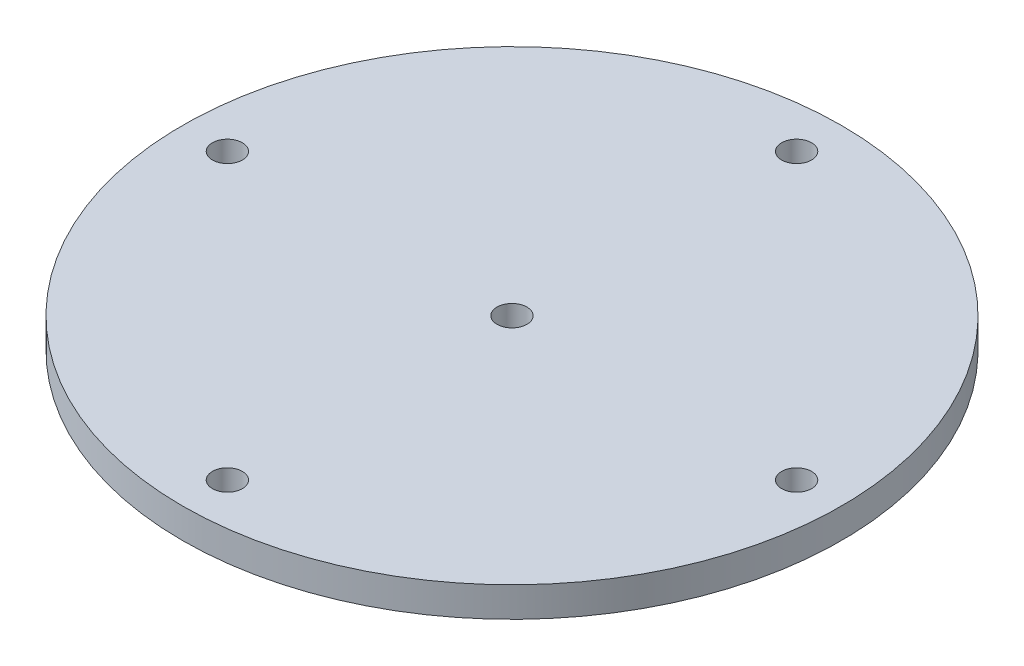
ISO-10303-21;
HEADER;
FILE_DESCRIPTION(('STEP AP214'),'2;1');
FILE_NAME('part.step','',(''),(''),'','','');
FILE_SCHEMA(('AUTOMOTIVE_DESIGN { 1 0 10303 214 1 1 1 1 }'));
ENDSEC;
DATA;
#1=APPLICATION_CONTEXT('core data for automotive mechanical design processes');
#2=APPLICATION_PROTOCOL_DEFINITION('international standard','automotive_design',2000,#1);
#3=PRODUCT_CONTEXT('',#1,'mechanical');
#4=PRODUCT('Part','Part','',(#3));
#5=PRODUCT_RELATED_PRODUCT_CATEGORY('part','',(#4));
#6=PRODUCT_DEFINITION_FORMATION('','',#4);
#7=PRODUCT_DEFINITION_CONTEXT('part definition',#1,'design');
#8=PRODUCT_DEFINITION('design','',#6,#7);
#9=PRODUCT_DEFINITION_SHAPE('','',#8);
#10=(LENGTH_UNIT() NAMED_UNIT(*) SI_UNIT(.MILLI.,.METRE.));
#11=(NAMED_UNIT(*) PLANE_ANGLE_UNIT() SI_UNIT($,.RADIAN.));
#12=(NAMED_UNIT(*) SI_UNIT($,.STERADIAN.) SOLID_ANGLE_UNIT());
#13=UNCERTAINTY_MEASURE_WITH_UNIT(LENGTH_MEASURE(1.E-05),#10,'distance_accuracy_value','');
#14=(GEOMETRIC_REPRESENTATION_CONTEXT(3) GLOBAL_UNCERTAINTY_ASSIGNED_CONTEXT((#13)) GLOBAL_UNIT_ASSIGNED_CONTEXT((#10,
#11,#12)) REPRESENTATION_CONTEXT('',''));
#15=CARTESIAN_POINT('',(0.,0.,0.));
#16=DIRECTION('',(0.,0.,1.));
#17=DIRECTION('',(1.,0.,0.));
#18=AXIS2_PLACEMENT_3D('',#15,#16,#17);
#19=CARTESIAN_POINT('',(0.,0.,0.));
#20=DIRECTION('',(0.,-1.,0.));
#21=DIRECTION('',(0.,0.,-1.));
#22=AXIS2_PLACEMENT_3D('',#19,#20,#21);
#23=PLANE('',#22);
#24=CARTESIAN_POINT('',(0.,0.,-190.));
#25=DIRECTION('',(0.,-1.,0.));
#26=DIRECTION('',(0.,0.,-1.));
#27=AXIS2_PLACEMENT_3D('',#24,#25,#26);
#28=CIRCLE('',#27,10.);
#29=CARTESIAN_POINT('',(0.,0.,-200.));
#30=VERTEX_POINT('',#29);
#31=EDGE_CURVE('E12',#30,#30,#28,.T.);
#32=ORIENTED_EDGE('',*,*,#31,.F.);
#33=EDGE_LOOP('',(#32));
#34=FACE_BOUND('',#33,.T.);
#35=ADVANCED_FACE('F52',(#34),#23,.F.);
#36=CARTESIAN_POINT('',(0.,0.,-190.));
#37=DIRECTION('',(0.,1.,0.));
#38=DIRECTION('',(0.,0.,1.));
#39=AXIS2_PLACEMENT_3D('',#36,#37,#38);
#40=CONICAL_SURFACE('',#39,10.,0.785398163397449);
#41=CARTESIAN_POINT('',(0.,-10.,-190.));
#42=VERTEX_POINT('',#41);
#43=VERTEX_LOOP('',#42);
#44=FACE_BOUND('',#43,.T.);
#45=ORIENTED_EDGE('',*,*,#31,.T.);
#46=EDGE_LOOP('',(#45));
#47=FACE_BOUND('',#46,.T.);
#48=ADVANCED_FACE('F59',(#44,#47),#40,.T.);
#49=CLOSED_SHELL('',(#35,#48));
#50=MANIFOLD_SOLID_BREP('B2',#49);
#51=CARTESIAN_POINT('',(0.,0.,0.));
#52=DIRECTION('',(0.,1.,0.));
#53=DIRECTION('',(0.,0.,1.));
#54=AXIS2_PLACEMENT_3D('',#51,#52,#53);
#55=PLANE('',#54);
#56=CARTESIAN_POINT('',(190.,0.,0.));
#57=DIRECTION('',(0.,1.,0.));
#58=DIRECTION('',(0.,0.,1.));
#59=AXIS2_PLACEMENT_3D('',#56,#57,#58);
#60=CIRCLE('',#59,10.);
#61=CARTESIAN_POINT('',(190.,0.,10.));
#62=VERTEX_POINT('',#61);
#63=EDGE_CURVE('E50',#62,#62,#60,.T.);
#64=ORIENTED_EDGE('',*,*,#63,.T.);
#65=EDGE_LOOP('',(#64));
#66=FACE_BOUND('',#65,.T.);
#67=ADVANCED_FACE('F90',(#66),#55,.T.);
#68=CARTESIAN_POINT('',(190.,0.,0.));
#69=DIRECTION('',(0.,1.,0.));
#70=DIRECTION('',(0.,0.,1.));
#71=AXIS2_PLACEMENT_3D('',#68,#69,#70);
#72=CONICAL_SURFACE('',#71,10.,0.785398163397449);
#73=CARTESIAN_POINT('',(190.,-9.99999999999996,0.));
#74=VERTEX_POINT('',#73);
#75=VERTEX_LOOP('',#74);
#76=FACE_BOUND('',#75,.T.);
#77=ORIENTED_EDGE('',*,*,#63,.F.);
#78=EDGE_LOOP('',(#77));
#79=FACE_BOUND('',#78,.T.);
#80=ADVANCED_FACE('F97',(#76,#79),#72,.T.);
#81=CLOSED_SHELL('',(#67,#80));
#82=MANIFOLD_SOLID_BREP('B6',#81);
#83=CARTESIAN_POINT('',(0.,0.,0.));
#84=DIRECTION('',(0.,-1.,0.));
#85=DIRECTION('',(0.,0.,-1.));
#86=AXIS2_PLACEMENT_3D('',#83,#84,#85);
#87=PLANE('',#86);
#88=CARTESIAN_POINT('',(0.,0.,190.));
#89=DIRECTION('',(0.,-1.,0.));
#90=DIRECTION('',(0.,0.,-1.));
#91=AXIS2_PLACEMENT_3D('',#88,#89,#90);
#92=CIRCLE('',#91,10.);
#93=CARTESIAN_POINT('',(0.,0.,180.));
#94=VERTEX_POINT('',#93);
#95=EDGE_CURVE('E88',#94,#94,#92,.T.);
#96=ORIENTED_EDGE('',*,*,#95,.F.);
#97=EDGE_LOOP('',(#96));
#98=FACE_BOUND('',#97,.T.);
#99=ADVANCED_FACE('F128',(#98),#87,.F.);
#100=CARTESIAN_POINT('',(0.,0.,190.));
#101=DIRECTION('',(0.,1.,0.));
#102=DIRECTION('',(0.,0.,1.));
#103=AXIS2_PLACEMENT_3D('',#100,#101,#102);
#104=CONICAL_SURFACE('',#103,10.,0.785398163397448);
#105=CARTESIAN_POINT('',(0.,-9.99999999999999,190.));
#106=VERTEX_POINT('',#105);
#107=VERTEX_LOOP('',#106);
#108=FACE_BOUND('',#107,.T.);
#109=ORIENTED_EDGE('',*,*,#95,.T.);
#110=EDGE_LOOP('',(#109));
#111=FACE_BOUND('',#110,.T.);
#112=ADVANCED_FACE('F135',(#108,#111),#104,.T.);
#113=CLOSED_SHELL('',(#99,#112));
#114=MANIFOLD_SOLID_BREP('B44',#113);
#115=CARTESIAN_POINT('',(0.,0.,0.));
#116=DIRECTION('',(0.,1.,0.));
#117=DIRECTION('',(0.,0.,1.));
#118=AXIS2_PLACEMENT_3D('',#115,#116,#117);
#119=PLANE('',#118);
#120=CARTESIAN_POINT('',(-190.,0.,0.));
#121=DIRECTION('',(0.,1.,0.));
#122=DIRECTION('',(0.,0.,1.));
#123=AXIS2_PLACEMENT_3D('',#120,#121,#122);
#124=CIRCLE('',#123,10.);
#125=CARTESIAN_POINT('',(-190.,0.,10.));
#126=VERTEX_POINT('',#125);
#127=EDGE_CURVE('E126',#126,#126,#124,.T.);
#128=ORIENTED_EDGE('',*,*,#127,.T.);
#129=EDGE_LOOP('',(#128));
#130=FACE_BOUND('',#129,.T.);
#131=ADVANCED_FACE('F166',(#130),#119,.T.);
#132=CARTESIAN_POINT('',(-190.,0.,0.));
#133=DIRECTION('',(0.,1.,0.));
#134=DIRECTION('',(0.,0.,1.));
#135=AXIS2_PLACEMENT_3D('',#132,#133,#134);
#136=CONICAL_SURFACE('',#135,10.,0.785398163397448);
#137=CARTESIAN_POINT('',(-190.,-9.99999999999999,0.));
#138=VERTEX_POINT('',#137);
#139=VERTEX_LOOP('',#138);
#140=FACE_BOUND('',#139,.T.);
#141=ORIENTED_EDGE('',*,*,#127,.F.);
#142=EDGE_LOOP('',(#141));
#143=FACE_BOUND('',#142,.T.);
#144=ADVANCED_FACE('F173',(#140,#143),#136,.T.);
#145=CLOSED_SHELL('',(#131,#144));
#146=MANIFOLD_SOLID_BREP('B82',#145);
#147=CARTESIAN_POINT('',(0.,0.,0.));
#148=DIRECTION('',(0.,1.,0.));
#149=DIRECTION('',(-1.,0.,0.));
#150=AXIS2_PLACEMENT_3D('',#147,#148,#149);
#151=PLANE('',#150);
#152=CARTESIAN_POINT('',(0.,0.,0.));
#153=DIRECTION('',(0.,1.,0.));
#154=DIRECTION('',(-1.,0.,0.));
#155=AXIS2_PLACEMENT_3D('',#152,#153,#154);
#156=CIRCLE('',#155,10.);
#157=CARTESIAN_POINT('',(-10.,0.,0.));
#158=VERTEX_POINT('',#157);
#159=EDGE_CURVE('E164',#158,#158,#156,.T.);
#160=ORIENTED_EDGE('',*,*,#159,.T.);
#161=EDGE_LOOP('',(#160));
#162=FACE_BOUND('',#161,.T.);
#163=ADVANCED_FACE('F201',(#162),#151,.T.);
#164=CARTESIAN_POINT('',(0.,-10.,0.));
#165=DIRECTION('',(0.,1.,0.));
#166=DIRECTION('',(-1.,0.,0.));
#167=AXIS2_PLACEMENT_3D('',#164,#165,#166);
#168=CONICAL_SURFACE('',#167,0.,0.785398163397448);
#169=ORIENTED_EDGE('',*,*,#159,.F.);
#170=EDGE_LOOP('',(#169));
#171=FACE_BOUND('',#170,.T.);
#172=CARTESIAN_POINT('',(0.,-10.,0.));
#173=VERTEX_POINT('',#172);
#174=VERTEX_LOOP('',#173);
#175=FACE_BOUND('',#174,.T.);
#176=ADVANCED_FACE('F208',(#171,#175),#168,.T.);
#177=CLOSED_SHELL('',(#163,#176));
#178=MANIFOLD_SOLID_BREP('B120',#177);
#179=CARTESIAN_POINT('',(0.,20.,0.));
#180=DIRECTION('',(0.,1.,0.));
#181=DIRECTION('',(0.,0.,1.));
#182=AXIS2_PLACEMENT_3D('',#179,#180,#181);
#183=PLANE('',#182);
#184=CARTESIAN_POINT('',(-190.,20.,0.));
#185=DIRECTION('',(0.,1.,0.));
#186=DIRECTION('',(0.,0.,1.));
#187=AXIS2_PLACEMENT_3D('',#184,#185,#186);
#188=CIRCLE('',#187,10.);
#189=CARTESIAN_POINT('',(-190.,20.,10.));
#190=VERTEX_POINT('',#189);
#191=EDGE_CURVE('E264',#190,#190,#188,.T.);
#192=ORIENTED_EDGE('',*,*,#191,.F.);
#193=EDGE_LOOP('',(#192));
#194=FACE_BOUND('',#193,.T.);
#195=CARTESIAN_POINT('',(190.,20.,0.));
#196=DIRECTION('',(0.,1.,0.));
#197=DIRECTION('',(0.,0.,1.));
#198=AXIS2_PLACEMENT_3D('',#195,#196,#197);
#199=CIRCLE('',#198,10.);
#200=CARTESIAN_POINT('',(190.,20.,10.));
#201=VERTEX_POINT('',#200);
#202=EDGE_CURVE('E248',#201,#201,#199,.T.);
#203=ORIENTED_EDGE('',*,*,#202,.F.);
#204=EDGE_LOOP('',(#203));
#205=FACE_BOUND('',#204,.T.);
#206=CARTESIAN_POINT('',(0.,20.,0.));
#207=DIRECTION('',(0.,1.,0.));
#208=DIRECTION('',(0.,0.,1.));
#209=AXIS2_PLACEMENT_3D('',#206,#207,#208);
#210=CIRCLE('',#209,220.);
#211=CARTESIAN_POINT('',(0.,20.,220.));
#212=VERTEX_POINT('',#211);
#213=EDGE_CURVE('E200',#212,#212,#210,.T.);
#214=ORIENTED_EDGE('',*,*,#213,.T.);
#215=EDGE_LOOP('',(#214));
#216=FACE_BOUND('',#215,.T.);
#217=CARTESIAN_POINT('',(0.,20.,-190.));
#218=DIRECTION('',(0.,1.,0.));
#219=DIRECTION('',(0.,0.,1.));
#220=AXIS2_PLACEMENT_3D('',#217,#218,#219);
#221=CIRCLE('',#220,10.);
#222=CARTESIAN_POINT('',(0.,20.,-180.));
#223=VERTEX_POINT('',#222);
#224=EDGE_CURVE('E242',#223,#223,#221,.T.);
#225=ORIENTED_EDGE('',*,*,#224,.F.);
#226=EDGE_LOOP('',(#225));
#227=FACE_BOUND('',#226,.T.);
#228=CARTESIAN_POINT('',(0.,20.,190.));
#229=DIRECTION('',(0.,1.,0.));
#230=DIRECTION('',(0.,0.,1.));
#231=AXIS2_PLACEMENT_3D('',#228,#229,#230);
#232=CIRCLE('',#231,10.);
#233=CARTESIAN_POINT('',(0.,20.,200.));
#234=VERTEX_POINT('',#233);
#235=EDGE_CURVE('E256',#234,#234,#232,.T.);
#236=ORIENTED_EDGE('',*,*,#235,.F.);
#237=EDGE_LOOP('',(#236));
#238=FACE_BOUND('',#237,.T.);
#239=CARTESIAN_POINT('',(0.,20.,0.));
#240=DIRECTION('',(0.,1.,0.));
#241=DIRECTION('',(0.,0.,1.));
#242=AXIS2_PLACEMENT_3D('',#239,#240,#241);
#243=CIRCLE('',#242,10.);
#244=CARTESIAN_POINT('',(0.,20.,10.));
#245=VERTEX_POINT('',#244);
#246=EDGE_CURVE('E272',#245,#245,#243,.T.);
#247=ORIENTED_EDGE('',*,*,#246,.F.);
#248=EDGE_LOOP('',(#247));
#249=FACE_BOUND('',#248,.T.);
#250=ADVANCED_FACE('F229',(#194,#205,#216,#227,#238,#249),#183,.T.);
#251=CARTESIAN_POINT('',(0.,0.,0.));
#252=DIRECTION('',(0.,1.,0.));
#253=DIRECTION('',(0.,0.,1.));
#254=AXIS2_PLACEMENT_3D('',#251,#252,#253);
#255=PLANE('',#254);
#256=CARTESIAN_POINT('',(0.,0.,0.));
#257=DIRECTION('',(0.,1.,0.));
#258=DIRECTION('',(0.,0.,1.));
#259=AXIS2_PLACEMENT_3D('',#256,#257,#258);
#260=CIRCLE('',#259,220.);
#261=CARTESIAN_POINT('',(0.,0.,220.));
#262=VERTEX_POINT('',#261);
#263=EDGE_CURVE('E233',#262,#262,#260,.T.);
#264=ORIENTED_EDGE('',*,*,#263,.F.);
#265=EDGE_LOOP('',(#264));
#266=FACE_BOUND('',#265,.T.);
#267=CARTESIAN_POINT('',(0.,0.,-190.));
#268=DIRECTION('',(0.,1.,0.));
#269=DIRECTION('',(0.,0.,1.));
#270=AXIS2_PLACEMENT_3D('',#267,#268,#269);
#271=CIRCLE('',#270,10.);
#272=CARTESIAN_POINT('',(0.,0.,-180.));
#273=VERTEX_POINT('',#272);
#274=EDGE_CURVE('E244',#273,#273,#271,.T.);
#275=ORIENTED_EDGE('',*,*,#274,.T.);
#276=EDGE_LOOP('',(#275));
#277=FACE_BOUND('',#276,.T.);
#278=CARTESIAN_POINT('',(190.,0.,0.));
#279=DIRECTION('',(0.,1.,0.));
#280=DIRECTION('',(0.,0.,1.));
#281=AXIS2_PLACEMENT_3D('',#278,#279,#280);
#282=CIRCLE('',#281,10.);
#283=CARTESIAN_POINT('',(190.,0.,10.));
#284=VERTEX_POINT('',#283);
#285=EDGE_CURVE('E252',#284,#284,#282,.T.);
#286=ORIENTED_EDGE('',*,*,#285,.T.);
#287=EDGE_LOOP('',(#286));
#288=FACE_BOUND('',#287,.T.);
#289=CARTESIAN_POINT('',(0.,0.,190.));
#290=DIRECTION('',(0.,1.,0.));
#291=DIRECTION('',(0.,0.,1.));
#292=AXIS2_PLACEMENT_3D('',#289,#290,#291);
#293=CIRCLE('',#292,10.);
#294=CARTESIAN_POINT('',(0.,0.,200.));
#295=VERTEX_POINT('',#294);
#296=EDGE_CURVE('E260',#295,#295,#293,.T.);
#297=ORIENTED_EDGE('',*,*,#296,.T.);
#298=EDGE_LOOP('',(#297));
#299=FACE_BOUND('',#298,.T.);
#300=CARTESIAN_POINT('',(-190.,0.,0.));
#301=DIRECTION('',(0.,1.,0.));
#302=DIRECTION('',(0.,0.,1.));
#303=AXIS2_PLACEMENT_3D('',#300,#301,#302);
#304=CIRCLE('',#303,10.);
#305=CARTESIAN_POINT('',(-190.,0.,10.));
#306=VERTEX_POINT('',#305);
#307=EDGE_CURVE('E268',#306,#306,#304,.T.);
#308=ORIENTED_EDGE('',*,*,#307,.T.);
#309=EDGE_LOOP('',(#308));
#310=FACE_BOUND('',#309,.T.);
#311=CARTESIAN_POINT('',(0.,0.,0.));
#312=DIRECTION('',(0.,1.,0.));
#313=DIRECTION('',(0.,0.,1.));
#314=AXIS2_PLACEMENT_3D('',#311,#312,#313);
#315=CIRCLE('',#314,10.);
#316=CARTESIAN_POINT('',(0.,0.,10.));
#317=VERTEX_POINT('',#316);
#318=EDGE_CURVE('E276',#317,#317,#315,.T.);
#319=ORIENTED_EDGE('',*,*,#318,.T.);
#320=EDGE_LOOP('',(#319));
#321=FACE_BOUND('',#320,.T.);
#322=ADVANCED_FACE('F288',(#266,#277,#288,#299,#310,#321),#255,.F.);
#323=CARTESIAN_POINT('',(0.,20.,0.));
#324=DIRECTION('',(0.,-1.,0.));
#325=DIRECTION('',(0.,0.,-1.));
#326=AXIS2_PLACEMENT_3D('',#323,#324,#325);
#327=CYLINDRICAL_SURFACE('',#326,220.);
#328=ORIENTED_EDGE('',*,*,#213,.F.);
#329=EDGE_LOOP('',(#328));
#330=FACE_BOUND('',#329,.T.);
#331=ORIENTED_EDGE('',*,*,#263,.T.);
#332=EDGE_LOOP('',(#331));
#333=FACE_BOUND('',#332,.T.);
#334=ADVANCED_FACE('F231',(#330,#333),#327,.T.);
#335=CARTESIAN_POINT('',(0.,20.,-190.));
#336=DIRECTION('',(0.,-1.,0.));
#337=DIRECTION('',(0.,0.,-1.));
#338=AXIS2_PLACEMENT_3D('',#335,#336,#337);
#339=CYLINDRICAL_SURFACE('',#338,10.);
#340=ORIENTED_EDGE('',*,*,#224,.T.);
#341=EDGE_LOOP('',(#340));
#342=FACE_BOUND('',#341,.T.);
#343=ORIENTED_EDGE('',*,*,#274,.F.);
#344=EDGE_LOOP('',(#343));
#345=FACE_BOUND('',#344,.T.);
#346=ADVANCED_FACE('F298',(#342,#345),#339,.F.);
#347=CARTESIAN_POINT('',(190.,20.,0.));
#348=DIRECTION('',(0.,-1.,0.));
#349=DIRECTION('',(0.,0.,-1.));
#350=AXIS2_PLACEMENT_3D('',#347,#348,#349);
#351=CYLINDRICAL_SURFACE('',#350,10.);
#352=ORIENTED_EDGE('',*,*,#202,.T.);
#353=EDGE_LOOP('',(#352));
#354=FACE_BOUND('',#353,.T.);
#355=ORIENTED_EDGE('',*,*,#285,.F.);
#356=EDGE_LOOP('',(#355));
#357=FACE_BOUND('',#356,.T.);
#358=ADVANCED_FACE('F301',(#354,#357),#351,.F.);
#359=CARTESIAN_POINT('',(0.,20.,190.));
#360=DIRECTION('',(0.,-1.,0.));
#361=DIRECTION('',(0.,0.,-1.));
#362=AXIS2_PLACEMENT_3D('',#359,#360,#361);
#363=CYLINDRICAL_SURFACE('',#362,10.);
#364=ORIENTED_EDGE('',*,*,#235,.T.);
#365=EDGE_LOOP('',(#364));
#366=FACE_BOUND('',#365,.T.);
#367=ORIENTED_EDGE('',*,*,#296,.F.);
#368=EDGE_LOOP('',(#367));
#369=FACE_BOUND('',#368,.T.);
#370=ADVANCED_FACE('F305',(#366,#369),#363,.F.);
#371=CARTESIAN_POINT('',(-190.,20.,0.));
#372=DIRECTION('',(0.,-1.,0.));
#373=DIRECTION('',(0.,0.,-1.));
#374=AXIS2_PLACEMENT_3D('',#371,#372,#373);
#375=CYLINDRICAL_SURFACE('',#374,10.);
#376=ORIENTED_EDGE('',*,*,#191,.T.);
#377=EDGE_LOOP('',(#376));
#378=FACE_BOUND('',#377,.T.);
#379=ORIENTED_EDGE('',*,*,#307,.F.);
#380=EDGE_LOOP('',(#379));
#381=FACE_BOUND('',#380,.T.);
#382=ADVANCED_FACE('F309',(#378,#381),#375,.F.);
#383=CARTESIAN_POINT('',(0.,20.,0.));
#384=DIRECTION('',(0.,-1.,0.));
#385=DIRECTION('',(0.,0.,-1.));
#386=AXIS2_PLACEMENT_3D('',#383,#384,#385);
#387=CYLINDRICAL_SURFACE('',#386,10.);
#388=ORIENTED_EDGE('',*,*,#246,.T.);
#389=EDGE_LOOP('',(#388));
#390=FACE_BOUND('',#389,.T.);
#391=ORIENTED_EDGE('',*,*,#318,.F.);
#392=EDGE_LOOP('',(#391));
#393=FACE_BOUND('',#392,.T.);
#394=ADVANCED_FACE('F284',(#390,#393),#387,.F.);
#395=CLOSED_SHELL('',(#250,#322,#334,#346,#358,#370,#382,#394));
#396=MANIFOLD_SOLID_BREP('B158',#395);
#397=ADVANCED_BREP_SHAPE_REPRESENTATION('',(#18,#50,#82,#114,#146,#178,#396),#14);
#398=SHAPE_DEFINITION_REPRESENTATION(#9,#397);
ENDSEC;
END-ISO-10303-21;
